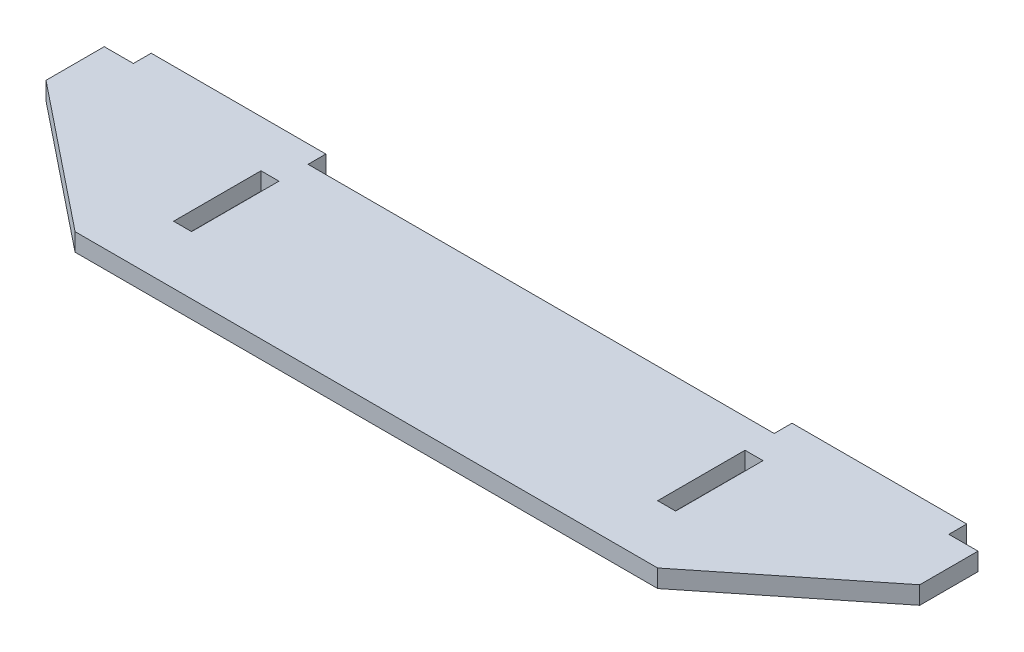
ISO-10303-21;
HEADER;
FILE_DESCRIPTION(('STEP AP214'),'2;1');
FILE_NAME('part.step','',(''),(''),'','','');
FILE_SCHEMA(('AUTOMOTIVE_DESIGN { 1 0 10303 214 1 1 1 1 }'));
ENDSEC;
DATA;
#1=APPLICATION_CONTEXT('core data for automotive mechanical design processes');
#2=APPLICATION_PROTOCOL_DEFINITION('international standard','automotive_design',2000,#1);
#3=PRODUCT_CONTEXT('',#1,'mechanical');
#4=PRODUCT('Part','Part','',(#3));
#5=PRODUCT_RELATED_PRODUCT_CATEGORY('part','',(#4));
#6=PRODUCT_DEFINITION_FORMATION('','',#4);
#7=PRODUCT_DEFINITION_CONTEXT('part definition',#1,'design');
#8=PRODUCT_DEFINITION('design','',#6,#7);
#9=PRODUCT_DEFINITION_SHAPE('','',#8);
#10=(LENGTH_UNIT() NAMED_UNIT(*) SI_UNIT(.MILLI.,.METRE.));
#11=(NAMED_UNIT(*) PLANE_ANGLE_UNIT() SI_UNIT($,.RADIAN.));
#12=(NAMED_UNIT(*) SI_UNIT($,.STERADIAN.) SOLID_ANGLE_UNIT());
#13=UNCERTAINTY_MEASURE_WITH_UNIT(LENGTH_MEASURE(1.E-05),#10,'distance_accuracy_value','');
#14=(GEOMETRIC_REPRESENTATION_CONTEXT(3) GLOBAL_UNCERTAINTY_ASSIGNED_CONTEXT((#13)) GLOBAL_UNIT_ASSIGNED_CONTEXT((#10,
#11,#12)) REPRESENTATION_CONTEXT('',''));
#15=CARTESIAN_POINT('',(0.,0.,0.));
#16=DIRECTION('',(0.,0.,1.));
#17=DIRECTION('',(1.,0.,0.));
#18=AXIS2_PLACEMENT_3D('',#15,#16,#17);
#19=CARTESIAN_POINT('',(0.,-354.96,0.));
#20=DIRECTION('',(0.,1.,0.));
#21=DIRECTION('',(0.,0.,1.));
#22=AXIS2_PLACEMENT_3D('',#19,#20,#21);
#23=PLANE('',#22);
#24=DIRECTION('',(0.,0.,1.));
#25=VECTOR('',#24,1.);
#26=CARTESIAN_POINT('',(43.09,-354.96,-24.07));
#27=LINE('',#26,#25);
#28=CARTESIAN_POINT('',(43.09,-354.96,-24.07));
#29=VERTEX_POINT('',#28);
#30=CARTESIAN_POINT('',(43.09,-354.96,-9.07000000000001));
#31=VERTEX_POINT('',#30);
#32=EDGE_CURVE('E230',#29,#31,#27,.T.);
#33=ORIENTED_EDGE('',*,*,#32,.F.);
#34=DIRECTION('',(1.,0.,0.));
#35=VECTOR('',#34,1.);
#36=CARTESIAN_POINT('',(43.09,-354.96,-24.07));
#37=LINE('',#36,#35);
#38=CARTESIAN_POINT('',(40.,-354.96,-24.07));
#39=VERTEX_POINT('',#38);
#40=EDGE_CURVE('E238',#39,#29,#37,.T.);
#41=ORIENTED_EDGE('',*,*,#40,.F.);
#42=DIRECTION('',(0.,0.,-1.));
#43=VECTOR('',#42,1.);
#44=CARTESIAN_POINT('',(40.,-354.96,-24.07));
#45=LINE('',#44,#43);
#46=CARTESIAN_POINT('',(40.,-354.96,-9.07000000000001));
#47=VERTEX_POINT('',#46);
#48=EDGE_CURVE('E235',#47,#39,#45,.T.);
#49=ORIENTED_EDGE('',*,*,#48,.F.);
#50=DIRECTION('',(-1.,0.,0.));
#51=VECTOR('',#50,1.);
#52=CARTESIAN_POINT('',(43.09,-354.96,-9.07000000000001));
#53=LINE('',#52,#51);
#54=EDGE_CURVE('E232',#31,#47,#53,.T.);
#55=ORIENTED_EDGE('',*,*,#54,.F.);
#56=EDGE_LOOP('',(#33,#41,#49,#55));
#57=FACE_BOUND('',#56,.T.);
#58=DIRECTION('',(1.,0.,0.));
#59=VECTOR('',#58,1.);
#60=CARTESIAN_POINT('',(-40.01,-354.96,-32.1299999999999));
#61=LINE('',#60,#59);
#62=CARTESIAN_POINT('',(-69.99,-354.96,-32.1299999999999));
#63=VERTEX_POINT('',#62);
#64=CARTESIAN_POINT('',(-40.01,-354.96,-32.1299999999999));
#65=VERTEX_POINT('',#64);
#66=EDGE_CURVE('E261',#63,#65,#61,.T.);
#67=ORIENTED_EDGE('',*,*,#66,.T.);
#68=DIRECTION('',(0.,0.,1.));
#69=VECTOR('',#68,1.);
#70=CARTESIAN_POINT('',(-40.01,-354.96,-29.0699999999999));
#71=LINE('',#70,#69);
#72=CARTESIAN_POINT('',(-40.01,-354.96,-29.0699999999999));
#73=VERTEX_POINT('',#72);
#74=EDGE_CURVE('E264',#65,#73,#71,.T.);
#75=ORIENTED_EDGE('',*,*,#74,.T.);
#76=DIRECTION('',(1.,0.,0.));
#77=VECTOR('',#76,1.);
#78=CARTESIAN_POINT('',(40.01,-354.96,-29.0699999999999));
#79=LINE('',#78,#77);
#80=CARTESIAN_POINT('',(40.01,-354.96,-29.0699999999999));
#81=VERTEX_POINT('',#80);
#82=EDGE_CURVE('E267',#73,#81,#79,.T.);
#83=ORIENTED_EDGE('',*,*,#82,.T.);
#84=DIRECTION('',(0.,0.,-1.));
#85=VECTOR('',#84,1.);
#86=CARTESIAN_POINT('',(40.01,-354.96,-32.1299999999999));
#87=LINE('',#86,#85);
#88=CARTESIAN_POINT('',(40.01,-354.96,-32.1299999999999));
#89=VERTEX_POINT('',#88);
#90=EDGE_CURVE('E269',#81,#89,#87,.T.);
#91=ORIENTED_EDGE('',*,*,#90,.T.);
#92=DIRECTION('',(1.,0.,0.));
#93=VECTOR('',#92,1.);
#94=CARTESIAN_POINT('',(69.99,-354.96,-32.1299999999999));
#95=LINE('',#94,#93);
#96=CARTESIAN_POINT('',(69.99,-354.96,-32.1299999999999));
#97=VERTEX_POINT('',#96);
#98=EDGE_CURVE('E271',#89,#97,#95,.T.);
#99=ORIENTED_EDGE('',*,*,#98,.T.);
#100=DIRECTION('',(0.,0.,1.));
#101=VECTOR('',#100,1.);
#102=CARTESIAN_POINT('',(69.99,-354.96,-29.0699999999999));
#103=LINE('',#102,#101);
#104=CARTESIAN_POINT('',(69.99,-354.96,-29.0699999999999));
#105=VERTEX_POINT('',#104);
#106=EDGE_CURVE('E273',#97,#105,#103,.T.);
#107=ORIENTED_EDGE('',*,*,#106,.T.);
#108=DIRECTION('',(1.,0.,0.));
#109=VECTOR('',#108,1.);
#110=CARTESIAN_POINT('',(74.99,-354.96,-29.0699999999999));
#111=LINE('',#110,#109);
#112=CARTESIAN_POINT('',(74.99,-354.96,-29.0699999999999));
#113=VERTEX_POINT('',#112);
#114=EDGE_CURVE('E275',#105,#113,#111,.T.);
#115=ORIENTED_EDGE('',*,*,#114,.T.);
#116=DIRECTION('',(0.,0.,1.));
#117=VECTOR('',#116,1.);
#118=CARTESIAN_POINT('',(74.99,-354.96,-19.0699999999999));
#119=LINE('',#118,#117);
#120=CARTESIAN_POINT('',(74.99,-354.96,-19.0699999999999));
#121=VERTEX_POINT('',#120);
#122=EDGE_CURVE('E277',#113,#121,#119,.T.);
#123=ORIENTED_EDGE('',*,*,#122,.T.);
#124=DIRECTION('',(-0.780746873119722,0.,0.624847437470761));
#125=VECTOR('',#124,1.);
#126=CARTESIAN_POINT('',(50.,-354.96,0.929999999999993));
#127=LINE('',#126,#125);
#128=CARTESIAN_POINT('',(50.,-354.96,0.929999999999993));
#129=VERTEX_POINT('',#128);
#130=EDGE_CURVE('E279',#121,#129,#127,.T.);
#131=ORIENTED_EDGE('',*,*,#130,.T.);
#132=DIRECTION('',(-1.,0.,0.));
#133=VECTOR('',#132,1.);
#134=CARTESIAN_POINT('',(-50.,-354.96,0.929999999999993));
#135=LINE('',#134,#133);
#136=CARTESIAN_POINT('',(-50.,-354.96,0.929999999999993));
#137=VERTEX_POINT('',#136);
#138=EDGE_CURVE('E281',#129,#137,#135,.T.);
#139=ORIENTED_EDGE('',*,*,#138,.T.);
#140=DIRECTION('',(-0.780746873119722,0.,-0.624847437470761));
#141=VECTOR('',#140,1.);
#142=CARTESIAN_POINT('',(-74.99,-354.96,-19.0699999999999));
#143=LINE('',#142,#141);
#144=CARTESIAN_POINT('',(-74.99,-354.96,-19.0699999999999));
#145=VERTEX_POINT('',#144);
#146=EDGE_CURVE('E283',#137,#145,#143,.T.);
#147=ORIENTED_EDGE('',*,*,#146,.T.);
#148=DIRECTION('',(0.,0.,-1.));
#149=VECTOR('',#148,1.);
#150=CARTESIAN_POINT('',(-74.99,-354.96,-29.0699999999999));
#151=LINE('',#150,#149);
#152=CARTESIAN_POINT('',(-74.99,-354.96,-29.0699999999999));
#153=VERTEX_POINT('',#152);
#154=EDGE_CURVE('E285',#145,#153,#151,.T.);
#155=ORIENTED_EDGE('',*,*,#154,.T.);
#156=DIRECTION('',(1.,0.,0.));
#157=VECTOR('',#156,1.);
#158=CARTESIAN_POINT('',(-69.99,-354.96,-29.0699999999999));
#159=LINE('',#158,#157);
#160=CARTESIAN_POINT('',(-69.99,-354.96,-29.0699999999999));
#161=VERTEX_POINT('',#160);
#162=EDGE_CURVE('E287',#153,#161,#159,.T.);
#163=ORIENTED_EDGE('',*,*,#162,.T.);
#164=DIRECTION('',(0.,0.,-1.));
#165=VECTOR('',#164,1.);
#166=CARTESIAN_POINT('',(-69.99,-354.96,-32.1299999999999));
#167=LINE('',#166,#165);
#168=EDGE_CURVE('E289',#161,#63,#167,.T.);
#169=ORIENTED_EDGE('',*,*,#168,.T.);
#170=EDGE_LOOP('',(#67,#75,#83,#91,#99,#107,#115,#123,#131,#139,#147,#155,#163,#169));
#171=FACE_BOUND('',#170,.T.);
#172=DIRECTION('',(0.,0.,-1.));
#173=VECTOR('',#172,1.);
#174=CARTESIAN_POINT('',(-43.09,-354.96,-24.07));
#175=LINE('',#174,#173);
#176=CARTESIAN_POINT('',(-43.09,-354.96,-9.07000000000001));
#177=VERTEX_POINT('',#176);
#178=CARTESIAN_POINT('',(-43.09,-354.96,-24.07));
#179=VERTEX_POINT('',#178);
#180=EDGE_CURVE('E194',#177,#179,#175,.T.);
#181=ORIENTED_EDGE('',*,*,#180,.F.);
#182=DIRECTION('',(-1.,0.,0.));
#183=VECTOR('',#182,1.);
#184=CARTESIAN_POINT('',(-43.09,-354.96,-9.07000000000001));
#185=LINE('',#184,#183);
#186=CARTESIAN_POINT('',(-40.,-354.96,-9.07000000000001));
#187=VERTEX_POINT('',#186);
#188=EDGE_CURVE('E216',#187,#177,#185,.T.);
#189=ORIENTED_EDGE('',*,*,#188,.F.);
#190=DIRECTION('',(0.,0.,1.));
#191=VECTOR('',#190,1.);
#192=CARTESIAN_POINT('',(-40.,-354.96,-24.07));
#193=LINE('',#192,#191);
#194=CARTESIAN_POINT('',(-40.,-354.96,-24.07));
#195=VERTEX_POINT('',#194);
#196=EDGE_CURVE('E214',#195,#187,#193,.T.);
#197=ORIENTED_EDGE('',*,*,#196,.F.);
#198=DIRECTION('',(1.,0.,0.));
#199=VECTOR('',#198,1.);
#200=CARTESIAN_POINT('',(-43.09,-354.96,-24.07));
#201=LINE('',#200,#199);
#202=EDGE_CURVE('E202',#179,#195,#201,.T.);
#203=ORIENTED_EDGE('',*,*,#202,.F.);
#204=EDGE_LOOP('',(#181,#189,#197,#203));
#205=FACE_BOUND('',#204,.T.);
#206=ADVANCED_FACE('F45',(#57,#171,#205),#23,.F.);
#207=CARTESIAN_POINT('',(0.,-351.9,0.));
#208=DIRECTION('',(0.,1.,0.));
#209=DIRECTION('',(0.,0.,1.));
#210=AXIS2_PLACEMENT_3D('',#207,#208,#209);
#211=PLANE('',#210);
#212=DIRECTION('',(1.,0.,0.));
#213=VECTOR('',#212,1.);
#214=CARTESIAN_POINT('',(-40.01,-351.9,-32.1299999999999));
#215=LINE('',#214,#213);
#216=CARTESIAN_POINT('',(-69.99,-351.9,-32.1299999999999));
#217=VERTEX_POINT('',#216);
#218=CARTESIAN_POINT('',(-40.01,-351.9,-32.1299999999999));
#219=VERTEX_POINT('',#218);
#220=EDGE_CURVE('E260',#217,#219,#215,.T.);
#221=ORIENTED_EDGE('',*,*,#220,.F.);
#222=DIRECTION('',(0.,0.,-1.));
#223=VECTOR('',#222,1.);
#224=CARTESIAN_POINT('',(-69.99,-351.9,-32.1299999999999));
#225=LINE('',#224,#223);
#226=CARTESIAN_POINT('',(-69.99,-351.9,-29.0699999999999));
#227=VERTEX_POINT('',#226);
#228=EDGE_CURVE('E265',#227,#217,#225,.T.);
#229=ORIENTED_EDGE('',*,*,#228,.F.);
#230=DIRECTION('',(1.,0.,0.));
#231=VECTOR('',#230,1.);
#232=CARTESIAN_POINT('',(-69.99,-351.9,-29.0699999999999));
#233=LINE('',#232,#231);
#234=CARTESIAN_POINT('',(-74.99,-351.9,-29.0699999999999));
#235=VERTEX_POINT('',#234);
#236=EDGE_CURVE('E316',#235,#227,#233,.T.);
#237=ORIENTED_EDGE('',*,*,#236,.F.);
#238=DIRECTION('',(0.,0.,-1.));
#239=VECTOR('',#238,1.);
#240=CARTESIAN_POINT('',(-74.99,-351.9,-29.0699999999999));
#241=LINE('',#240,#239);
#242=CARTESIAN_POINT('',(-74.99,-351.9,-19.0699999999999));
#243=VERTEX_POINT('',#242);
#244=EDGE_CURVE('E314',#243,#235,#241,.T.);
#245=ORIENTED_EDGE('',*,*,#244,.F.);
#246=DIRECTION('',(-0.780746873119722,0.,-0.624847437470761));
#247=VECTOR('',#246,1.);
#248=CARTESIAN_POINT('',(-74.99,-351.9,-19.0699999999999));
#249=LINE('',#248,#247);
#250=CARTESIAN_POINT('',(-50.,-351.9,0.929999999999993));
#251=VERTEX_POINT('',#250);
#252=EDGE_CURVE('E312',#251,#243,#249,.T.);
#253=ORIENTED_EDGE('',*,*,#252,.F.);
#254=DIRECTION('',(-1.,0.,0.));
#255=VECTOR('',#254,1.);
#256=CARTESIAN_POINT('',(-50.,-351.9,0.929999999999993));
#257=LINE('',#256,#255);
#258=CARTESIAN_POINT('',(50.,-351.9,0.929999999999993));
#259=VERTEX_POINT('',#258);
#260=EDGE_CURVE('E310',#259,#251,#257,.T.);
#261=ORIENTED_EDGE('',*,*,#260,.F.);
#262=DIRECTION('',(-0.780746873119722,0.,0.624847437470761));
#263=VECTOR('',#262,1.);
#264=CARTESIAN_POINT('',(50.,-351.9,0.929999999999993));
#265=LINE('',#264,#263);
#266=CARTESIAN_POINT('',(74.99,-351.9,-19.0699999999999));
#267=VERTEX_POINT('',#266);
#268=EDGE_CURVE('E308',#267,#259,#265,.T.);
#269=ORIENTED_EDGE('',*,*,#268,.F.);
#270=DIRECTION('',(0.,0.,1.));
#271=VECTOR('',#270,1.);
#272=CARTESIAN_POINT('',(74.99,-351.9,-19.0699999999999));
#273=LINE('',#272,#271);
#274=CARTESIAN_POINT('',(74.99,-351.9,-29.0699999999999));
#275=VERTEX_POINT('',#274);
#276=EDGE_CURVE('E306',#275,#267,#273,.T.);
#277=ORIENTED_EDGE('',*,*,#276,.F.);
#278=DIRECTION('',(1.,0.,0.));
#279=VECTOR('',#278,1.);
#280=CARTESIAN_POINT('',(74.99,-351.9,-29.0699999999999));
#281=LINE('',#280,#279);
#282=CARTESIAN_POINT('',(69.99,-351.9,-29.0699999999999));
#283=VERTEX_POINT('',#282);
#284=EDGE_CURVE('E304',#283,#275,#281,.T.);
#285=ORIENTED_EDGE('',*,*,#284,.F.);
#286=DIRECTION('',(0.,0.,1.));
#287=VECTOR('',#286,1.);
#288=CARTESIAN_POINT('',(69.99,-351.9,-29.0699999999999));
#289=LINE('',#288,#287);
#290=CARTESIAN_POINT('',(69.99,-351.9,-32.1299999999999));
#291=VERTEX_POINT('',#290);
#292=EDGE_CURVE('E302',#291,#283,#289,.T.);
#293=ORIENTED_EDGE('',*,*,#292,.F.);
#294=DIRECTION('',(1.,0.,0.));
#295=VECTOR('',#294,1.);
#296=CARTESIAN_POINT('',(69.99,-351.9,-32.1299999999999));
#297=LINE('',#296,#295);
#298=CARTESIAN_POINT('',(40.01,-351.9,-32.1299999999999));
#299=VERTEX_POINT('',#298);
#300=EDGE_CURVE('E300',#299,#291,#297,.T.);
#301=ORIENTED_EDGE('',*,*,#300,.F.);
#302=DIRECTION('',(0.,0.,-1.));
#303=VECTOR('',#302,1.);
#304=CARTESIAN_POINT('',(40.01,-351.9,-32.1299999999999));
#305=LINE('',#304,#303);
#306=CARTESIAN_POINT('',(40.01,-351.9,-29.0699999999999));
#307=VERTEX_POINT('',#306);
#308=EDGE_CURVE('E298',#307,#299,#305,.T.);
#309=ORIENTED_EDGE('',*,*,#308,.F.);
#310=DIRECTION('',(1.,0.,0.));
#311=VECTOR('',#310,1.);
#312=CARTESIAN_POINT('',(40.01,-351.9,-29.0699999999999));
#313=LINE('',#312,#311);
#314=CARTESIAN_POINT('',(-40.01,-351.9,-29.0699999999999));
#315=VERTEX_POINT('',#314);
#316=EDGE_CURVE('E296',#315,#307,#313,.T.);
#317=ORIENTED_EDGE('',*,*,#316,.F.);
#318=DIRECTION('',(0.,0.,1.));
#319=VECTOR('',#318,1.);
#320=CARTESIAN_POINT('',(-40.01,-351.9,-29.0699999999999));
#321=LINE('',#320,#319);
#322=EDGE_CURVE('E294',#219,#315,#321,.T.);
#323=ORIENTED_EDGE('',*,*,#322,.F.);
#324=EDGE_LOOP('',(#221,#229,#237,#245,#253,#261,#269,#277,#285,#293,#301,#309,#317,#323));
#325=FACE_BOUND('',#324,.T.);
#326=DIRECTION('',(1.,0.,0.));
#327=VECTOR('',#326,1.);
#328=CARTESIAN_POINT('',(43.09,-351.9,-24.07));
#329=LINE('',#328,#327);
#330=CARTESIAN_POINT('',(40.,-351.9,-24.07));
#331=VERTEX_POINT('',#330);
#332=CARTESIAN_POINT('',(43.09,-351.9,-24.07));
#333=VERTEX_POINT('',#332);
#334=EDGE_CURVE('E233',#331,#333,#329,.T.);
#335=ORIENTED_EDGE('',*,*,#334,.T.);
#336=DIRECTION('',(0.,0.,1.));
#337=VECTOR('',#336,1.);
#338=CARTESIAN_POINT('',(43.09,-351.9,-24.07));
#339=LINE('',#338,#337);
#340=CARTESIAN_POINT('',(43.09,-351.9,-9.07000000000001));
#341=VERTEX_POINT('',#340);
#342=EDGE_CURVE('E210',#333,#341,#339,.T.);
#343=ORIENTED_EDGE('',*,*,#342,.T.);
#344=DIRECTION('',(-1.,0.,0.));
#345=VECTOR('',#344,1.);
#346=CARTESIAN_POINT('',(43.09,-351.9,-9.07000000000001));
#347=LINE('',#346,#345);
#348=CARTESIAN_POINT('',(40.,-351.9,-9.07000000000001));
#349=VERTEX_POINT('',#348);
#350=EDGE_CURVE('E243',#341,#349,#347,.T.);
#351=ORIENTED_EDGE('',*,*,#350,.T.);
#352=DIRECTION('',(0.,0.,-1.));
#353=VECTOR('',#352,1.);
#354=CARTESIAN_POINT('',(40.,-351.9,-24.07));
#355=LINE('',#354,#353);
#356=EDGE_CURVE('E246',#349,#331,#355,.T.);
#357=ORIENTED_EDGE('',*,*,#356,.T.);
#358=EDGE_LOOP('',(#335,#343,#351,#357));
#359=FACE_BOUND('',#358,.T.);
#360=DIRECTION('',(-1.,0.,0.));
#361=VECTOR('',#360,1.);
#362=CARTESIAN_POINT('',(-43.09,-351.9,-9.07000000000001));
#363=LINE('',#362,#361);
#364=CARTESIAN_POINT('',(-40.,-351.9,-9.07000000000001));
#365=VERTEX_POINT('',#364);
#366=CARTESIAN_POINT('',(-43.09,-351.9,-9.07000000000001));
#367=VERTEX_POINT('',#366);
#368=EDGE_CURVE('E203',#365,#367,#363,.T.);
#369=ORIENTED_EDGE('',*,*,#368,.T.);
#370=DIRECTION('',(0.,0.,-1.));
#371=VECTOR('',#370,1.);
#372=CARTESIAN_POINT('',(-43.09,-351.9,-24.07));
#373=LINE('',#372,#371);
#374=CARTESIAN_POINT('',(-43.09,-351.9,-24.07));
#375=VERTEX_POINT('',#374);
#376=EDGE_CURVE('E68',#367,#375,#373,.T.);
#377=ORIENTED_EDGE('',*,*,#376,.T.);
#378=DIRECTION('',(1.,0.,0.));
#379=VECTOR('',#378,1.);
#380=CARTESIAN_POINT('',(-43.09,-351.9,-24.07));
#381=LINE('',#380,#379);
#382=CARTESIAN_POINT('',(-40.,-351.9,-24.07));
#383=VERTEX_POINT('',#382);
#384=EDGE_CURVE('E209',#375,#383,#381,.T.);
#385=ORIENTED_EDGE('',*,*,#384,.T.);
#386=DIRECTION('',(0.,0.,1.));
#387=VECTOR('',#386,1.);
#388=CARTESIAN_POINT('',(-40.,-351.9,-24.07));
#389=LINE('',#388,#387);
#390=EDGE_CURVE('E222',#383,#365,#389,.T.);
#391=ORIENTED_EDGE('',*,*,#390,.T.);
#392=EDGE_LOOP('',(#369,#377,#385,#391));
#393=FACE_BOUND('',#392,.T.);
#394=ADVANCED_FACE('F364',(#325,#359,#393),#211,.T.);
#395=CARTESIAN_POINT('',(-40.01,-354.96,-32.1299999999999));
#396=DIRECTION('',(0.,0.,1.));
#397=DIRECTION('',(1.,0.,0.));
#398=AXIS2_PLACEMENT_3D('',#395,#396,#397);
#399=PLANE('',#398);
#400=ORIENTED_EDGE('',*,*,#220,.T.);
#401=DIRECTION('',(0.,1.,0.));
#402=VECTOR('',#401,1.);
#403=CARTESIAN_POINT('',(-40.01,-354.96,-32.1299999999999));
#404=LINE('',#403,#402);
#405=EDGE_CURVE('E12',#65,#219,#404,.T.);
#406=ORIENTED_EDGE('',*,*,#405,.F.);
#407=ORIENTED_EDGE('',*,*,#66,.F.);
#408=DIRECTION('',(0.,1.,0.));
#409=VECTOR('',#408,1.);
#410=CARTESIAN_POINT('',(-69.99,-354.96,-32.1299999999999));
#411=LINE('',#410,#409);
#412=EDGE_CURVE('E291',#63,#217,#411,.T.);
#413=ORIENTED_EDGE('',*,*,#412,.T.);
#414=EDGE_LOOP('',(#400,#406,#407,#413));
#415=FACE_BOUND('',#414,.T.);
#416=ADVANCED_FACE('F47',(#415),#399,.F.);
#417=CARTESIAN_POINT('',(-40.01,-354.96,-29.0699999999999));
#418=DIRECTION('',(-1.,0.,0.));
#419=DIRECTION('',(0.,0.,1.));
#420=AXIS2_PLACEMENT_3D('',#417,#418,#419);
#421=PLANE('',#420);
#422=ORIENTED_EDGE('',*,*,#322,.T.);
#423=DIRECTION('',(0.,1.,0.));
#424=VECTOR('',#423,1.);
#425=CARTESIAN_POINT('',(-40.01,-354.96,-29.0699999999999));
#426=LINE('',#425,#424);
#427=EDGE_CURVE('E53',#73,#315,#426,.T.);
#428=ORIENTED_EDGE('',*,*,#427,.F.);
#429=ORIENTED_EDGE('',*,*,#74,.F.);
#430=ORIENTED_EDGE('',*,*,#405,.T.);
#431=EDGE_LOOP('',(#422,#428,#429,#430));
#432=FACE_BOUND('',#431,.T.);
#433=ADVANCED_FACE('F381',(#432),#421,.F.);
#434=CARTESIAN_POINT('',(40.01,-354.96,-29.0699999999999));
#435=DIRECTION('',(0.,0.,1.));
#436=DIRECTION('',(1.,0.,0.));
#437=AXIS2_PLACEMENT_3D('',#434,#435,#436);
#438=PLANE('',#437);
#439=ORIENTED_EDGE('',*,*,#316,.T.);
#440=DIRECTION('',(0.,1.,0.));
#441=VECTOR('',#440,1.);
#442=CARTESIAN_POINT('',(40.01,-354.96,-29.0699999999999));
#443=LINE('',#442,#441);
#444=EDGE_CURVE('E351',#81,#307,#443,.T.);
#445=ORIENTED_EDGE('',*,*,#444,.F.);
#446=ORIENTED_EDGE('',*,*,#82,.F.);
#447=ORIENTED_EDGE('',*,*,#427,.T.);
#448=EDGE_LOOP('',(#439,#445,#446,#447));
#449=FACE_BOUND('',#448,.T.);
#450=ADVANCED_FACE('F358',(#449),#438,.F.);
#451=CARTESIAN_POINT('',(40.01,-354.96,-32.1299999999999));
#452=DIRECTION('',(1.,0.,0.));
#453=DIRECTION('',(0.,0.,-1.));
#454=AXIS2_PLACEMENT_3D('',#451,#452,#453);
#455=PLANE('',#454);
#456=ORIENTED_EDGE('',*,*,#308,.T.);
#457=DIRECTION('',(0.,1.,0.));
#458=VECTOR('',#457,1.);
#459=CARTESIAN_POINT('',(40.01,-354.96,-32.1299999999999));
#460=LINE('',#459,#458);
#461=EDGE_CURVE('E348',#89,#299,#460,.T.);
#462=ORIENTED_EDGE('',*,*,#461,.F.);
#463=ORIENTED_EDGE('',*,*,#90,.F.);
#464=ORIENTED_EDGE('',*,*,#444,.T.);
#465=EDGE_LOOP('',(#456,#462,#463,#464));
#466=FACE_BOUND('',#465,.T.);
#467=ADVANCED_FACE('F370',(#466),#455,.F.);
#468=CARTESIAN_POINT('',(69.99,-354.96,-32.1299999999999));
#469=DIRECTION('',(0.,0.,1.));
#470=DIRECTION('',(1.,0.,0.));
#471=AXIS2_PLACEMENT_3D('',#468,#469,#470);
#472=PLANE('',#471);
#473=ORIENTED_EDGE('',*,*,#300,.T.);
#474=DIRECTION('',(0.,1.,0.));
#475=VECTOR('',#474,1.);
#476=CARTESIAN_POINT('',(69.99,-354.96,-32.1299999999999));
#477=LINE('',#476,#475);
#478=EDGE_CURVE('E345',#97,#291,#477,.T.);
#479=ORIENTED_EDGE('',*,*,#478,.F.);
#480=ORIENTED_EDGE('',*,*,#98,.F.);
#481=ORIENTED_EDGE('',*,*,#461,.T.);
#482=EDGE_LOOP('',(#473,#479,#480,#481));
#483=FACE_BOUND('',#482,.T.);
#484=ADVANCED_FACE('F374',(#483),#472,.F.);
#485=CARTESIAN_POINT('',(69.99,-354.96,-29.0699999999999));
#486=DIRECTION('',(-1.,0.,0.));
#487=DIRECTION('',(0.,0.,1.));
#488=AXIS2_PLACEMENT_3D('',#485,#486,#487);
#489=PLANE('',#488);
#490=ORIENTED_EDGE('',*,*,#292,.T.);
#491=DIRECTION('',(0.,1.,0.));
#492=VECTOR('',#491,1.);
#493=CARTESIAN_POINT('',(69.99,-354.96,-29.0699999999999));
#494=LINE('',#493,#492);
#495=EDGE_CURVE('E342',#105,#283,#494,.T.);
#496=ORIENTED_EDGE('',*,*,#495,.F.);
#497=ORIENTED_EDGE('',*,*,#106,.F.);
#498=ORIENTED_EDGE('',*,*,#478,.T.);
#499=EDGE_LOOP('',(#490,#496,#497,#498));
#500=FACE_BOUND('',#499,.T.);
#501=ADVANCED_FACE('F424',(#500),#489,.F.);
#502=CARTESIAN_POINT('',(74.99,-354.96,-29.0699999999999));
#503=DIRECTION('',(0.,0.,1.));
#504=DIRECTION('',(1.,0.,0.));
#505=AXIS2_PLACEMENT_3D('',#502,#503,#504);
#506=PLANE('',#505);
#507=ORIENTED_EDGE('',*,*,#284,.T.);
#508=DIRECTION('',(0.,1.,0.));
#509=VECTOR('',#508,1.);
#510=CARTESIAN_POINT('',(74.99,-354.96,-29.0699999999999));
#511=LINE('',#510,#509);
#512=EDGE_CURVE('E339',#113,#275,#511,.T.);
#513=ORIENTED_EDGE('',*,*,#512,.F.);
#514=ORIENTED_EDGE('',*,*,#114,.F.);
#515=ORIENTED_EDGE('',*,*,#495,.T.);
#516=EDGE_LOOP('',(#507,#513,#514,#515));
#517=FACE_BOUND('',#516,.T.);
#518=ADVANCED_FACE('F422',(#517),#506,.F.);
#519=CARTESIAN_POINT('',(74.99,-354.96,-19.0699999999999));
#520=DIRECTION('',(-1.,0.,0.));
#521=DIRECTION('',(0.,0.,1.));
#522=AXIS2_PLACEMENT_3D('',#519,#520,#521);
#523=PLANE('',#522);
#524=ORIENTED_EDGE('',*,*,#276,.T.);
#525=DIRECTION('',(0.,1.,0.));
#526=VECTOR('',#525,1.);
#527=CARTESIAN_POINT('',(74.99,-354.96,-19.0699999999999));
#528=LINE('',#527,#526);
#529=EDGE_CURVE('E336',#121,#267,#528,.T.);
#530=ORIENTED_EDGE('',*,*,#529,.F.);
#531=ORIENTED_EDGE('',*,*,#122,.F.);
#532=ORIENTED_EDGE('',*,*,#512,.T.);
#533=EDGE_LOOP('',(#524,#530,#531,#532));
#534=FACE_BOUND('',#533,.T.);
#535=ADVANCED_FACE('F417',(#534),#523,.F.);
#536=CARTESIAN_POINT('',(50.,-354.96,0.929999999999993));
#537=DIRECTION('',(-0.624847437470761,0.,-0.780746873119722));
#538=DIRECTION('',(-0.780746873119722,0.,0.624847437470761));
#539=AXIS2_PLACEMENT_3D('',#536,#537,#538);
#540=PLANE('',#539);
#541=ORIENTED_EDGE('',*,*,#268,.T.);
#542=DIRECTION('',(0.,1.,0.));
#543=VECTOR('',#542,1.);
#544=CARTESIAN_POINT('',(50.,-354.96,0.929999999999993));
#545=LINE('',#544,#543);
#546=EDGE_CURVE('E333',#129,#259,#545,.T.);
#547=ORIENTED_EDGE('',*,*,#546,.F.);
#548=ORIENTED_EDGE('',*,*,#130,.F.);
#549=ORIENTED_EDGE('',*,*,#529,.T.);
#550=EDGE_LOOP('',(#541,#547,#548,#549));
#551=FACE_BOUND('',#550,.T.);
#552=ADVANCED_FACE('F412',(#551),#540,.F.);
#553=CARTESIAN_POINT('',(-50.,-354.96,0.929999999999993));
#554=DIRECTION('',(0.,0.,-1.));
#555=DIRECTION('',(-1.,0.,0.));
#556=AXIS2_PLACEMENT_3D('',#553,#554,#555);
#557=PLANE('',#556);
#558=ORIENTED_EDGE('',*,*,#260,.T.);
#559=DIRECTION('',(0.,1.,0.));
#560=VECTOR('',#559,1.);
#561=CARTESIAN_POINT('',(-50.,-354.96,0.929999999999993));
#562=LINE('',#561,#560);
#563=EDGE_CURVE('E330',#137,#251,#562,.T.);
#564=ORIENTED_EDGE('',*,*,#563,.F.);
#565=ORIENTED_EDGE('',*,*,#138,.F.);
#566=ORIENTED_EDGE('',*,*,#546,.T.);
#567=EDGE_LOOP('',(#558,#564,#565,#566));
#568=FACE_BOUND('',#567,.T.);
#569=ADVANCED_FACE('F408',(#568),#557,.F.);
#570=CARTESIAN_POINT('',(-74.99,-354.96,-19.0699999999999));
#571=DIRECTION('',(0.624847437470761,0.,-0.780746873119722));
#572=DIRECTION('',(-0.780746873119722,0.,-0.624847437470761));
#573=AXIS2_PLACEMENT_3D('',#570,#571,#572);
#574=PLANE('',#573);
#575=ORIENTED_EDGE('',*,*,#252,.T.);
#576=DIRECTION('',(0.,1.,0.));
#577=VECTOR('',#576,1.);
#578=CARTESIAN_POINT('',(-74.99,-354.96,-19.0699999999999));
#579=LINE('',#578,#577);
#580=EDGE_CURVE('E327',#145,#243,#579,.T.);
#581=ORIENTED_EDGE('',*,*,#580,.F.);
#582=ORIENTED_EDGE('',*,*,#146,.F.);
#583=ORIENTED_EDGE('',*,*,#563,.T.);
#584=EDGE_LOOP('',(#575,#581,#582,#583));
#585=FACE_BOUND('',#584,.T.);
#586=ADVANCED_FACE('F403',(#585),#574,.F.);
#587=CARTESIAN_POINT('',(-74.99,-354.96,-29.0699999999999));
#588=DIRECTION('',(1.,0.,0.));
#589=DIRECTION('',(0.,0.,-1.));
#590=AXIS2_PLACEMENT_3D('',#587,#588,#589);
#591=PLANE('',#590);
#592=ORIENTED_EDGE('',*,*,#244,.T.);
#593=DIRECTION('',(0.,1.,0.));
#594=VECTOR('',#593,1.);
#595=CARTESIAN_POINT('',(-74.99,-354.96,-29.0699999999999));
#596=LINE('',#595,#594);
#597=EDGE_CURVE('E324',#153,#235,#596,.T.);
#598=ORIENTED_EDGE('',*,*,#597,.F.);
#599=ORIENTED_EDGE('',*,*,#154,.F.);
#600=ORIENTED_EDGE('',*,*,#580,.T.);
#601=EDGE_LOOP('',(#592,#598,#599,#600));
#602=FACE_BOUND('',#601,.T.);
#603=ADVANCED_FACE('F397',(#602),#591,.F.);
#604=CARTESIAN_POINT('',(-69.99,-354.96,-29.0699999999999));
#605=DIRECTION('',(0.,0.,1.));
#606=DIRECTION('',(1.,0.,0.));
#607=AXIS2_PLACEMENT_3D('',#604,#605,#606);
#608=PLANE('',#607);
#609=ORIENTED_EDGE('',*,*,#236,.T.);
#610=DIRECTION('',(0.,1.,0.));
#611=VECTOR('',#610,1.);
#612=CARTESIAN_POINT('',(-69.99,-354.96,-29.0699999999999));
#613=LINE('',#612,#611);
#614=EDGE_CURVE('E321',#161,#227,#613,.T.);
#615=ORIENTED_EDGE('',*,*,#614,.F.);
#616=ORIENTED_EDGE('',*,*,#162,.F.);
#617=ORIENTED_EDGE('',*,*,#597,.T.);
#618=EDGE_LOOP('',(#609,#615,#616,#617));
#619=FACE_BOUND('',#618,.T.);
#620=ADVANCED_FACE('F393',(#619),#608,.F.);
#621=CARTESIAN_POINT('',(-69.99,-354.96,-32.1299999999999));
#622=DIRECTION('',(1.,0.,0.));
#623=DIRECTION('',(0.,0.,-1.));
#624=AXIS2_PLACEMENT_3D('',#621,#622,#623);
#625=PLANE('',#624);
#626=ORIENTED_EDGE('',*,*,#228,.T.);
#627=ORIENTED_EDGE('',*,*,#412,.F.);
#628=ORIENTED_EDGE('',*,*,#168,.F.);
#629=ORIENTED_EDGE('',*,*,#614,.T.);
#630=EDGE_LOOP('',(#626,#627,#628,#629));
#631=FACE_BOUND('',#630,.T.);
#632=ADVANCED_FACE('F388',(#631),#625,.F.);
#633=CARTESIAN_POINT('',(43.09,-354.96,-24.07));
#634=DIRECTION('',(-1.,0.,0.));
#635=DIRECTION('',(0.,0.,1.));
#636=AXIS2_PLACEMENT_3D('',#633,#634,#635);
#637=PLANE('',#636);
#638=ORIENTED_EDGE('',*,*,#342,.F.);
#639=DIRECTION('',(0.,1.,0.));
#640=VECTOR('',#639,1.);
#641=CARTESIAN_POINT('',(43.09,-354.96,-24.07));
#642=LINE('',#641,#640);
#643=EDGE_CURVE('E240',#29,#333,#642,.T.);
#644=ORIENTED_EDGE('',*,*,#643,.F.);
#645=ORIENTED_EDGE('',*,*,#32,.T.);
#646=DIRECTION('',(0.,1.,0.));
#647=VECTOR('',#646,1.);
#648=CARTESIAN_POINT('',(43.09,-354.96,-9.07000000000001));
#649=LINE('',#648,#647);
#650=EDGE_CURVE('E257',#31,#341,#649,.T.);
#651=ORIENTED_EDGE('',*,*,#650,.T.);
#652=EDGE_LOOP('',(#638,#644,#645,#651));
#653=FACE_BOUND('',#652,.T.);
#654=ADVANCED_FACE('F444',(#653),#637,.T.);
#655=CARTESIAN_POINT('',(43.09,-354.96,-9.07000000000001));
#656=DIRECTION('',(0.,0.,-1.));
#657=DIRECTION('',(-1.,0.,0.));
#658=AXIS2_PLACEMENT_3D('',#655,#656,#657);
#659=PLANE('',#658);
#660=ORIENTED_EDGE('',*,*,#350,.F.);
#661=ORIENTED_EDGE('',*,*,#650,.F.);
#662=ORIENTED_EDGE('',*,*,#54,.T.);
#663=DIRECTION('',(0.,1.,0.));
#664=VECTOR('',#663,1.);
#665=CARTESIAN_POINT('',(40.,-354.96,-9.07000000000001));
#666=LINE('',#665,#664);
#667=EDGE_CURVE('E255',#47,#349,#666,.T.);
#668=ORIENTED_EDGE('',*,*,#667,.T.);
#669=EDGE_LOOP('',(#660,#661,#662,#668));
#670=FACE_BOUND('',#669,.T.);
#671=ADVANCED_FACE('F504',(#670),#659,.T.);
#672=CARTESIAN_POINT('',(40.,-354.96,-24.07));
#673=DIRECTION('',(1.,0.,0.));
#674=DIRECTION('',(0.,0.,-1.));
#675=AXIS2_PLACEMENT_3D('',#672,#673,#674);
#676=PLANE('',#675);
#677=ORIENTED_EDGE('',*,*,#356,.F.);
#678=ORIENTED_EDGE('',*,*,#667,.F.);
#679=ORIENTED_EDGE('',*,*,#48,.T.);
#680=DIRECTION('',(0.,1.,0.));
#681=VECTOR('',#680,1.);
#682=CARTESIAN_POINT('',(40.,-354.96,-24.07));
#683=LINE('',#682,#681);
#684=EDGE_CURVE('E253',#39,#331,#683,.T.);
#685=ORIENTED_EDGE('',*,*,#684,.T.);
#686=EDGE_LOOP('',(#677,#678,#679,#685));
#687=FACE_BOUND('',#686,.T.);
#688=ADVANCED_FACE('F512',(#687),#676,.T.);
#689=CARTESIAN_POINT('',(43.09,-354.96,-24.07));
#690=DIRECTION('',(0.,0.,1.));
#691=DIRECTION('',(1.,0.,0.));
#692=AXIS2_PLACEMENT_3D('',#689,#690,#691);
#693=PLANE('',#692);
#694=ORIENTED_EDGE('',*,*,#334,.F.);
#695=ORIENTED_EDGE('',*,*,#684,.F.);
#696=ORIENTED_EDGE('',*,*,#40,.T.);
#697=ORIENTED_EDGE('',*,*,#643,.T.);
#698=EDGE_LOOP('',(#694,#695,#696,#697));
#699=FACE_BOUND('',#698,.T.);
#700=ADVANCED_FACE('F520',(#699),#693,.T.);
#701=CARTESIAN_POINT('',(-43.09,-354.96,-24.07));
#702=DIRECTION('',(1.,0.,0.));
#703=DIRECTION('',(0.,0.,-1.));
#704=AXIS2_PLACEMENT_3D('',#701,#702,#703);
#705=PLANE('',#704);
#706=ORIENTED_EDGE('',*,*,#376,.F.);
#707=DIRECTION('',(0.,1.,0.));
#708=VECTOR('',#707,1.);
#709=CARTESIAN_POINT('',(-43.09,-354.96,-9.07000000000001));
#710=LINE('',#709,#708);
#711=EDGE_CURVE('E198',#177,#367,#710,.T.);
#712=ORIENTED_EDGE('',*,*,#711,.F.);
#713=ORIENTED_EDGE('',*,*,#180,.T.);
#714=DIRECTION('',(0.,1.,0.));
#715=VECTOR('',#714,1.);
#716=CARTESIAN_POINT('',(-43.09,-354.96,-24.07));
#717=LINE('',#716,#715);
#718=EDGE_CURVE('E197',#179,#375,#717,.T.);
#719=ORIENTED_EDGE('',*,*,#718,.T.);
#720=EDGE_LOOP('',(#706,#712,#713,#719));
#721=FACE_BOUND('',#720,.T.);
#722=ADVANCED_FACE('F196',(#721),#705,.T.);
#723=CARTESIAN_POINT('',(-43.09,-354.96,-24.07));
#724=DIRECTION('',(0.,0.,1.));
#725=DIRECTION('',(1.,0.,0.));
#726=AXIS2_PLACEMENT_3D('',#723,#724,#725);
#727=PLANE('',#726);
#728=ORIENTED_EDGE('',*,*,#384,.F.);
#729=ORIENTED_EDGE('',*,*,#718,.F.);
#730=ORIENTED_EDGE('',*,*,#202,.T.);
#731=DIRECTION('',(0.,1.,0.));
#732=VECTOR('',#731,1.);
#733=CARTESIAN_POINT('',(-40.,-354.96,-24.07));
#734=LINE('',#733,#732);
#735=EDGE_CURVE('E211',#195,#383,#734,.T.);
#736=ORIENTED_EDGE('',*,*,#735,.T.);
#737=EDGE_LOOP('',(#728,#729,#730,#736));
#738=FACE_BOUND('',#737,.T.);
#739=ADVANCED_FACE('F206',(#738),#727,.T.);
#740=CARTESIAN_POINT('',(-40.,-354.96,-24.07));
#741=DIRECTION('',(-1.,0.,0.));
#742=DIRECTION('',(0.,0.,1.));
#743=AXIS2_PLACEMENT_3D('',#740,#741,#742);
#744=PLANE('',#743);
#745=ORIENTED_EDGE('',*,*,#390,.F.);
#746=ORIENTED_EDGE('',*,*,#735,.F.);
#747=ORIENTED_EDGE('',*,*,#196,.T.);
#748=DIRECTION('',(0.,1.,0.));
#749=VECTOR('',#748,1.);
#750=CARTESIAN_POINT('',(-40.,-354.96,-9.07000000000001));
#751=LINE('',#750,#749);
#752=EDGE_CURVE('E60',#187,#365,#751,.T.);
#753=ORIENTED_EDGE('',*,*,#752,.T.);
#754=EDGE_LOOP('',(#745,#746,#747,#753));
#755=FACE_BOUND('',#754,.T.);
#756=ADVANCED_FACE('F544',(#755),#744,.T.);
#757=CARTESIAN_POINT('',(-43.09,-354.96,-9.07000000000001));
#758=DIRECTION('',(0.,0.,-1.));
#759=DIRECTION('',(-1.,0.,0.));
#760=AXIS2_PLACEMENT_3D('',#757,#758,#759);
#761=PLANE('',#760);
#762=ORIENTED_EDGE('',*,*,#368,.F.);
#763=ORIENTED_EDGE('',*,*,#752,.F.);
#764=ORIENTED_EDGE('',*,*,#188,.T.);
#765=ORIENTED_EDGE('',*,*,#711,.T.);
#766=EDGE_LOOP('',(#762,#763,#764,#765));
#767=FACE_BOUND('',#766,.T.);
#768=ADVANCED_FACE('F552',(#767),#761,.T.);
#769=CLOSED_SHELL('',(#206,#394,#416,#433,#450,#467,#484,#501,#518,#535,#552,#569,#586,#603,
#620,#632,#654,#671,#688,#700,#722,#739,#756,#768));
#770=MANIFOLD_SOLID_BREP('B2',#769);
#771=ADVANCED_BREP_SHAPE_REPRESENTATION('',(#18,#770),#14);
#772=SHAPE_DEFINITION_REPRESENTATION(#9,#771);
ENDSEC;
END-ISO-10303-21;
